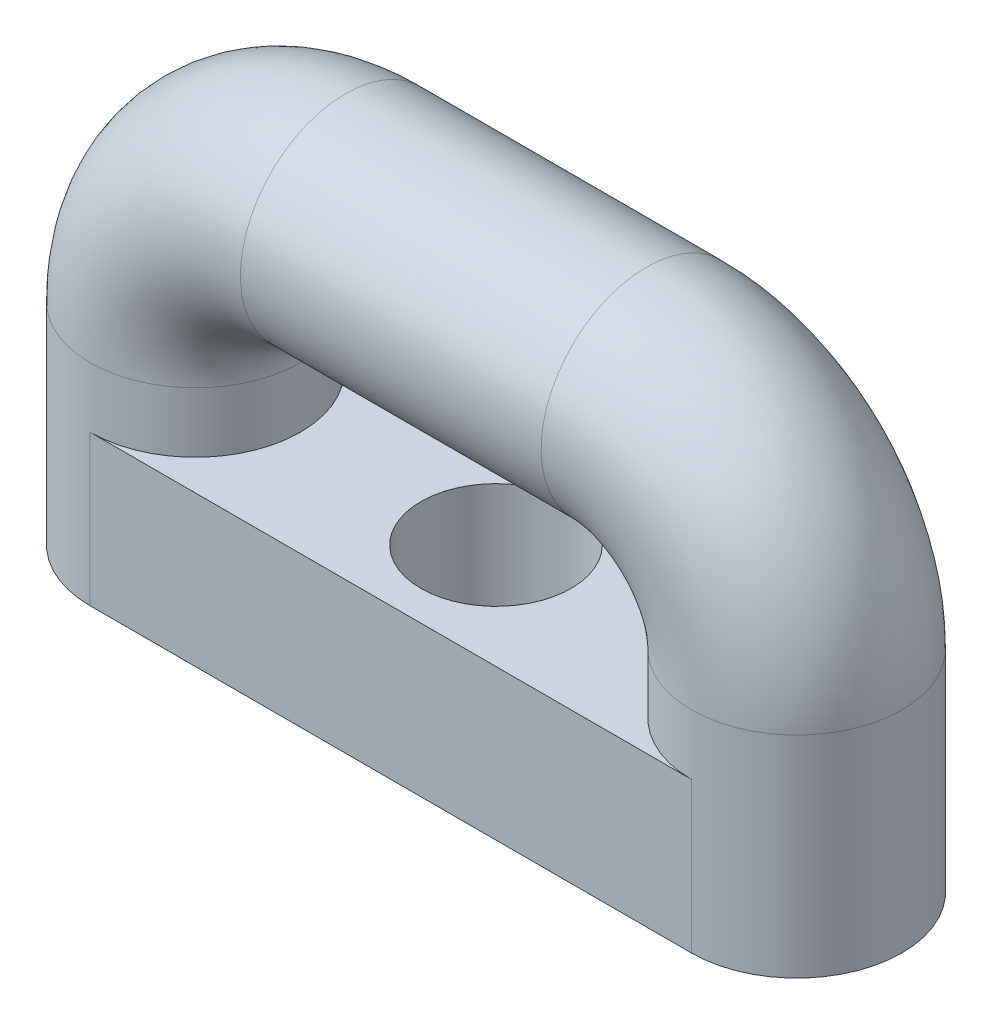
ISO-10303-21;
HEADER;
FILE_DESCRIPTION(('STEP AP214'),'2;1');
FILE_NAME('part.step','',(''),(''),'','','');
FILE_SCHEMA(('AUTOMOTIVE_DESIGN { 1 0 10303 214 1 1 1 1 }'));
ENDSEC;
DATA;
#1=APPLICATION_CONTEXT('core data for automotive mechanical design processes');
#2=APPLICATION_PROTOCOL_DEFINITION('international standard','automotive_design',2000,#1);
#3=PRODUCT_CONTEXT('',#1,'mechanical');
#4=PRODUCT('Part','Part','',(#3));
#5=PRODUCT_RELATED_PRODUCT_CATEGORY('part','',(#4));
#6=PRODUCT_DEFINITION_FORMATION('','',#4);
#7=PRODUCT_DEFINITION_CONTEXT('part definition',#1,'design');
#8=PRODUCT_DEFINITION('design','',#6,#7);
#9=PRODUCT_DEFINITION_SHAPE('','',#8);
#10=(LENGTH_UNIT() NAMED_UNIT(*) SI_UNIT(.MILLI.,.METRE.));
#11=(NAMED_UNIT(*) PLANE_ANGLE_UNIT() SI_UNIT($,.RADIAN.));
#12=(NAMED_UNIT(*) SI_UNIT($,.STERADIAN.) SOLID_ANGLE_UNIT());
#13=UNCERTAINTY_MEASURE_WITH_UNIT(LENGTH_MEASURE(1.E-05),#10,'distance_accuracy_value','');
#14=(GEOMETRIC_REPRESENTATION_CONTEXT(3) GLOBAL_UNCERTAINTY_ASSIGNED_CONTEXT((#13)) GLOBAL_UNIT_ASSIGNED_CONTEXT((#10,
#11,#12)) REPRESENTATION_CONTEXT('',''));
#15=CARTESIAN_POINT('',(0.,0.,0.));
#16=DIRECTION('',(0.,0.,1.));
#17=DIRECTION('',(1.,0.,0.));
#18=AXIS2_PLACEMENT_3D('',#15,#16,#17);
#19=CARTESIAN_POINT('',(12.7,6.35,0.));
#20=DIRECTION('',(0.,1.,0.));
#21=DIRECTION('',(0.,0.,1.));
#22=AXIS2_PLACEMENT_3D('',#19,#20,#21);
#23=PLANE('',#22);
#24=CARTESIAN_POINT('',(0.,6.35,0.));
#25=DIRECTION('',(0.,1.,0.));
#26=DIRECTION('',(0.,0.,1.));
#27=AXIS2_PLACEMENT_3D('',#24,#25,#26);
#28=CIRCLE('',#27,3.175);
#29=CARTESIAN_POINT('',(0.,6.35,3.175));
#30=VERTEX_POINT('',#29);
#31=EDGE_CURVE('E153',#30,#30,#28,.T.);
#32=ORIENTED_EDGE('',*,*,#31,.F.);
#33=EDGE_LOOP('',(#32));
#34=FACE_BOUND('',#33,.T.);
#35=CARTESIAN_POINT('',(12.7,6.35,0.));
#36=DIRECTION('',(0.,1.,0.));
#37=DIRECTION('',(0.,0.,1.));
#38=AXIS2_PLACEMENT_3D('',#35,#36,#37);
#39=CIRCLE('',#38,4.445);
#40=CARTESIAN_POINT('',(12.7,6.35,-4.445));
#41=VERTEX_POINT('',#40);
#42=CARTESIAN_POINT('',(12.7,6.35,4.445));
#43=VERTEX_POINT('',#42);
#44=EDGE_CURVE('E12',#41,#43,#39,.T.);
#45=ORIENTED_EDGE('',*,*,#44,.F.);
#46=DIRECTION('',(1.,0.,0.));
#47=VECTOR('',#46,1.);
#48=CARTESIAN_POINT('',(-12.7,6.35,-4.445));
#49=LINE('',#48,#47);
#50=CARTESIAN_POINT('',(-12.7,6.35,-4.445));
#51=VERTEX_POINT('',#50);
#52=EDGE_CURVE('E108',#51,#41,#49,.T.);
#53=ORIENTED_EDGE('',*,*,#52,.F.);
#54=CARTESIAN_POINT('',(-12.7,6.35,0.));
#55=DIRECTION('',(0.,-1.,0.));
#56=DIRECTION('',(0.,0.,1.));
#57=AXIS2_PLACEMENT_3D('',#54,#55,#56);
#58=CIRCLE('',#57,4.445);
#59=CARTESIAN_POINT('',(-12.7,6.35,4.445));
#60=VERTEX_POINT('',#59);
#61=EDGE_CURVE('E62',#51,#60,#58,.T.);
#62=ORIENTED_EDGE('',*,*,#61,.T.);
#63=DIRECTION('',(1.,0.,0.));
#64=VECTOR('',#63,1.);
#65=CARTESIAN_POINT('',(-12.7,6.35,4.445));
#66=LINE('',#65,#64);
#67=EDGE_CURVE('E123',#60,#43,#66,.T.);
#68=ORIENTED_EDGE('',*,*,#67,.T.);
#69=EDGE_LOOP('',(#45,#53,#62,#68));
#70=FACE_BOUND('',#69,.T.);
#71=ADVANCED_FACE('F51',(#34,#70),#23,.T.);
#72=CARTESIAN_POINT('',(-12.7,6.35,-4.445));
#73=DIRECTION('',(0.,0.,-1.));
#74=DIRECTION('',(-1.,0.,0.));
#75=AXIS2_PLACEMENT_3D('',#72,#73,#74);
#76=PLANE('',#75);
#77=DIRECTION('',(1.,0.,0.));
#78=VECTOR('',#77,1.);
#79=CARTESIAN_POINT('',(-12.7,0.,-4.445));
#80=LINE('',#79,#78);
#81=CARTESIAN_POINT('',(-12.7,0.,-4.445));
#82=VERTEX_POINT('',#81);
#83=CARTESIAN_POINT('',(12.7,0.,-4.445));
#84=VERTEX_POINT('',#83);
#85=EDGE_CURVE('E105',#82,#84,#80,.T.);
#86=ORIENTED_EDGE('',*,*,#85,.F.);
#87=DIRECTION('',(0.,-1.,0.));
#88=VECTOR('',#87,1.);
#89=CARTESIAN_POINT('',(-12.7,6.35,-4.445));
#90=LINE('',#89,#88);
#91=EDGE_CURVE('E90',#51,#82,#90,.T.);
#92=ORIENTED_EDGE('',*,*,#91,.F.);
#93=ORIENTED_EDGE('',*,*,#52,.T.);
#94=DIRECTION('',(0.,-1.,0.));
#95=VECTOR('',#94,1.);
#96=CARTESIAN_POINT('',(12.7,6.35,-4.445));
#97=LINE('',#96,#95);
#98=EDGE_CURVE('E55',#41,#84,#97,.T.);
#99=ORIENTED_EDGE('',*,*,#98,.T.);
#100=EDGE_LOOP('',(#86,#92,#93,#99));
#101=FACE_BOUND('',#100,.T.);
#102=ADVANCED_FACE('F53',(#101),#76,.T.);
#103=CARTESIAN_POINT('',(-12.7,6.35,0.));
#104=DIRECTION('',(0.,-1.,0.));
#105=DIRECTION('',(0.,0.,-1.));
#106=AXIS2_PLACEMENT_3D('',#103,#104,#105);
#107=CYLINDRICAL_SURFACE('',#106,4.445);
#108=CARTESIAN_POINT('',(-12.7,0.,0.));
#109=DIRECTION('',(0.,1.,0.));
#110=DIRECTION('',(0.,0.,1.));
#111=AXIS2_PLACEMENT_3D('',#108,#109,#110);
#112=CIRCLE('',#111,4.445);
#113=CARTESIAN_POINT('',(-12.7,0.,4.445));
#114=VERTEX_POINT('',#113);
#115=EDGE_CURVE('E87',#82,#114,#112,.T.);
#116=ORIENTED_EDGE('',*,*,#115,.T.);
#117=DIRECTION('',(0.,-1.,0.));
#118=VECTOR('',#117,1.);
#119=CARTESIAN_POINT('',(-12.7,6.35,4.445));
#120=LINE('',#119,#118);
#121=EDGE_CURVE('E98',#60,#114,#120,.T.);
#122=ORIENTED_EDGE('',*,*,#121,.F.);
#123=ORIENTED_EDGE('',*,*,#61,.F.);
#124=ORIENTED_EDGE('',*,*,#91,.T.);
#125=EDGE_LOOP('',(#116,#122,#123,#124));
#126=FACE_BOUND('',#125,.T.);
#127=CARTESIAN_POINT('',(-12.7,8.89,0.));
#128=DIRECTION('',(0.,-1.,0.));
#129=DIRECTION('',(0.,0.,1.));
#130=AXIS2_PLACEMENT_3D('',#127,#128,#129);
#131=CIRCLE('',#130,4.445);
#132=CARTESIAN_POINT('',(-17.145,8.89,0.));
#133=VERTEX_POINT('',#132);
#134=EDGE_CURVE('E114',#133,#133,#131,.T.);
#135=ORIENTED_EDGE('',*,*,#134,.T.);
#136=EDGE_LOOP('',(#135));
#137=FACE_BOUND('',#136,.T.);
#138=ADVANCED_FACE('F91',(#126,#137),#107,.T.);
#139=CARTESIAN_POINT('',(-12.7,6.35,4.445));
#140=DIRECTION('',(0.,0.,-1.));
#141=DIRECTION('',(-1.,0.,0.));
#142=AXIS2_PLACEMENT_3D('',#139,#140,#141);
#143=PLANE('',#142);
#144=DIRECTION('',(1.,0.,0.));
#145=VECTOR('',#144,1.);
#146=CARTESIAN_POINT('',(-12.7,0.,4.445));
#147=LINE('',#146,#145);
#148=CARTESIAN_POINT('',(12.7,0.,4.445));
#149=VERTEX_POINT('',#148);
#150=EDGE_CURVE('E106',#114,#149,#147,.T.);
#151=ORIENTED_EDGE('',*,*,#150,.T.);
#152=DIRECTION('',(0.,-1.,0.));
#153=VECTOR('',#152,1.);
#154=CARTESIAN_POINT('',(12.7,6.35,4.445));
#155=LINE('',#154,#153);
#156=EDGE_CURVE('E129',#43,#149,#155,.T.);
#157=ORIENTED_EDGE('',*,*,#156,.F.);
#158=ORIENTED_EDGE('',*,*,#67,.F.);
#159=ORIENTED_EDGE('',*,*,#121,.T.);
#160=EDGE_LOOP('',(#151,#157,#158,#159));
#161=FACE_BOUND('',#160,.T.);
#162=ADVANCED_FACE('F175',(#161),#143,.F.);
#163=CARTESIAN_POINT('',(12.7,6.35,0.));
#164=DIRECTION('',(0.,-1.,0.));
#165=DIRECTION('',(0.,0.,-1.));
#166=AXIS2_PLACEMENT_3D('',#163,#164,#165);
#167=CYLINDRICAL_SURFACE('',#166,4.445);
#168=CARTESIAN_POINT('',(12.7,0.,0.));
#169=DIRECTION('',(0.,1.,0.));
#170=DIRECTION('',(0.,0.,1.));
#171=AXIS2_PLACEMENT_3D('',#168,#169,#170);
#172=CIRCLE('',#171,4.445);
#173=EDGE_CURVE('E113',#149,#84,#172,.T.);
#174=ORIENTED_EDGE('',*,*,#173,.T.);
#175=ORIENTED_EDGE('',*,*,#98,.F.);
#176=ORIENTED_EDGE('',*,*,#44,.T.);
#177=ORIENTED_EDGE('',*,*,#156,.T.);
#178=EDGE_LOOP('',(#174,#175,#176,#177));
#179=FACE_BOUND('',#178,.T.);
#180=CARTESIAN_POINT('',(12.7,8.88999999999995,0.));
#181=DIRECTION('',(0.,1.,0.));
#182=DIRECTION('',(0.,0.,1.));
#183=AXIS2_PLACEMENT_3D('',#180,#181,#182);
#184=CIRCLE('',#183,4.445);
#185=CARTESIAN_POINT('',(17.145,8.88999999999992,0.));
#186=VERTEX_POINT('',#185);
#187=EDGE_CURVE('E148',#186,#186,#184,.T.);
#188=ORIENTED_EDGE('',*,*,#187,.F.);
#189=EDGE_LOOP('',(#188));
#190=FACE_BOUND('',#189,.T.);
#191=ADVANCED_FACE('F172',(#179,#190),#167,.T.);
#192=CARTESIAN_POINT('',(12.7,0.,0.));
#193=DIRECTION('',(0.,1.,0.));
#194=DIRECTION('',(0.,0.,1.));
#195=AXIS2_PLACEMENT_3D('',#192,#193,#194);
#196=PLANE('',#195);
#197=CARTESIAN_POINT('',(0.,0.,0.));
#198=DIRECTION('',(0.,1.,0.));
#199=DIRECTION('',(0.,0.,1.));
#200=AXIS2_PLACEMENT_3D('',#197,#198,#199);
#201=CIRCLE('',#200,3.175);
#202=CARTESIAN_POINT('',(0.,0.,3.175));
#203=VERTEX_POINT('',#202);
#204=EDGE_CURVE('E151',#203,#203,#201,.T.);
#205=ORIENTED_EDGE('',*,*,#204,.T.);
#206=EDGE_LOOP('',(#205));
#207=FACE_BOUND('',#206,.T.);
#208=ORIENTED_EDGE('',*,*,#85,.T.);
#209=ORIENTED_EDGE('',*,*,#173,.F.);
#210=ORIENTED_EDGE('',*,*,#150,.F.);
#211=ORIENTED_EDGE('',*,*,#115,.F.);
#212=EDGE_LOOP('',(#208,#209,#210,#211));
#213=FACE_BOUND('',#212,.T.);
#214=ADVANCED_FACE('F103',(#207,#213),#196,.F.);
#215=CARTESIAN_POINT('',(6.35,8.89,0.));
#216=DIRECTION('',(0.,0.,1.));
#217=DIRECTION('',(1.,0.,0.));
#218=AXIS2_PLACEMENT_3D('',#215,#216,#217);
#219=TOROIDAL_SURFACE('',#218,6.34999999999995,4.445);
#220=CARTESIAN_POINT('',(6.34999999999995,15.24,0.));
#221=DIRECTION('',(-1.,0.,0.));
#222=DIRECTION('',(0.,0.,1.));
#223=AXIS2_PLACEMENT_3D('',#220,#221,#222);
#224=CIRCLE('',#223,4.445);
#225=CARTESIAN_POINT('',(6.34999999999992,19.685,0.));
#226=VERTEX_POINT('',#225);
#227=EDGE_CURVE('E144',#226,#226,#224,.T.);
#228=CARTESIAN_POINT('',(6.35,8.89,0.));
#229=DIRECTION('',(0.,0.,1.));
#230=DIRECTION('',(1.,0.,0.));
#231=AXIS2_PLACEMENT_3D('',#228,#229,#230);
#232=CIRCLE('',#231,10.795);
#233=EDGE_CURVE('',#186,#226,#232,.T.);
#234=ORIENTED_EDGE('',*,*,#187,.T.);
#235=ORIENTED_EDGE('',*,*,#227,.F.);
#236=ORIENTED_EDGE('',*,*,#233,.T.);
#237=ORIENTED_EDGE('',*,*,#233,.F.);
#238=EDGE_LOOP('',(#234,#236,#235,#237));
#239=FACE_BOUND('',#238,.T.);
#240=ADVANCED_FACE('F167',(#239),#219,.T.);
#241=CARTESIAN_POINT('',(6.34999999999995,15.24,0.));
#242=DIRECTION('',(-1.,0.,0.));
#243=DIRECTION('',(0.,0.,1.));
#244=AXIS2_PLACEMENT_3D('',#241,#242,#243);
#245=CYLINDRICAL_SURFACE('',#244,4.445);
#246=CARTESIAN_POINT('',(-6.34999999999996,15.24,0.));
#247=DIRECTION('',(-1.,0.,0.));
#248=DIRECTION('',(0.,0.,1.));
#249=AXIS2_PLACEMENT_3D('',#246,#247,#248);
#250=CIRCLE('',#249,4.445);
#251=CARTESIAN_POINT('',(-6.34999999999993,19.685,0.));
#252=VERTEX_POINT('',#251);
#253=EDGE_CURVE('E120',#252,#252,#250,.T.);
#254=ORIENTED_EDGE('',*,*,#253,.F.);
#255=EDGE_LOOP('',(#254));
#256=FACE_BOUND('',#255,.T.);
#257=ORIENTED_EDGE('',*,*,#227,.T.);
#258=EDGE_LOOP('',(#257));
#259=FACE_BOUND('',#258,.T.);
#260=ADVANCED_FACE('F179',(#256,#259),#245,.T.);
#261=CARTESIAN_POINT('',(-6.35,8.89,0.));
#262=DIRECTION('',(0.,0.,1.));
#263=DIRECTION('',(1.,0.,0.));
#264=AXIS2_PLACEMENT_3D('',#261,#262,#263);
#265=TOROIDAL_SURFACE('',#264,6.35,4.445);
#266=CARTESIAN_POINT('',(-6.35,8.89,0.));
#267=DIRECTION('',(0.,0.,1.));
#268=DIRECTION('',(1.,0.,0.));
#269=AXIS2_PLACEMENT_3D('',#266,#267,#268);
#270=CIRCLE('',#269,10.795);
#271=EDGE_CURVE('',#252,#133,#270,.T.);
#272=ORIENTED_EDGE('',*,*,#253,.T.);
#273=ORIENTED_EDGE('',*,*,#134,.F.);
#274=ORIENTED_EDGE('',*,*,#271,.T.);
#275=ORIENTED_EDGE('',*,*,#271,.F.);
#276=EDGE_LOOP('',(#272,#274,#273,#275));
#277=FACE_BOUND('',#276,.T.);
#278=ADVANCED_FACE('F165',(#277),#265,.T.);
#279=CARTESIAN_POINT('',(0.,0.,0.));
#280=DIRECTION('',(0.,1.,0.));
#281=DIRECTION('',(0.,0.,1.));
#282=AXIS2_PLACEMENT_3D('',#279,#280,#281);
#283=CYLINDRICAL_SURFACE('',#282,3.175);
#284=ORIENTED_EDGE('',*,*,#204,.F.);
#285=EDGE_LOOP('',(#284));
#286=FACE_BOUND('',#285,.T.);
#287=ORIENTED_EDGE('',*,*,#31,.T.);
#288=EDGE_LOOP('',(#287));
#289=FACE_BOUND('',#288,.T.);
#290=ADVANCED_FACE('F162',(#286,#289),#283,.F.);
#291=CLOSED_SHELL('',(#71,#102,#138,#162,#191,#214,#240,#260,#278,#290));
#292=MANIFOLD_SOLID_BREP('B2',#291);
#293=ADVANCED_BREP_SHAPE_REPRESENTATION('',(#18,#292),#14);
#294=SHAPE_DEFINITION_REPRESENTATION(#9,#293);
ENDSEC;
END-ISO-10303-21;
